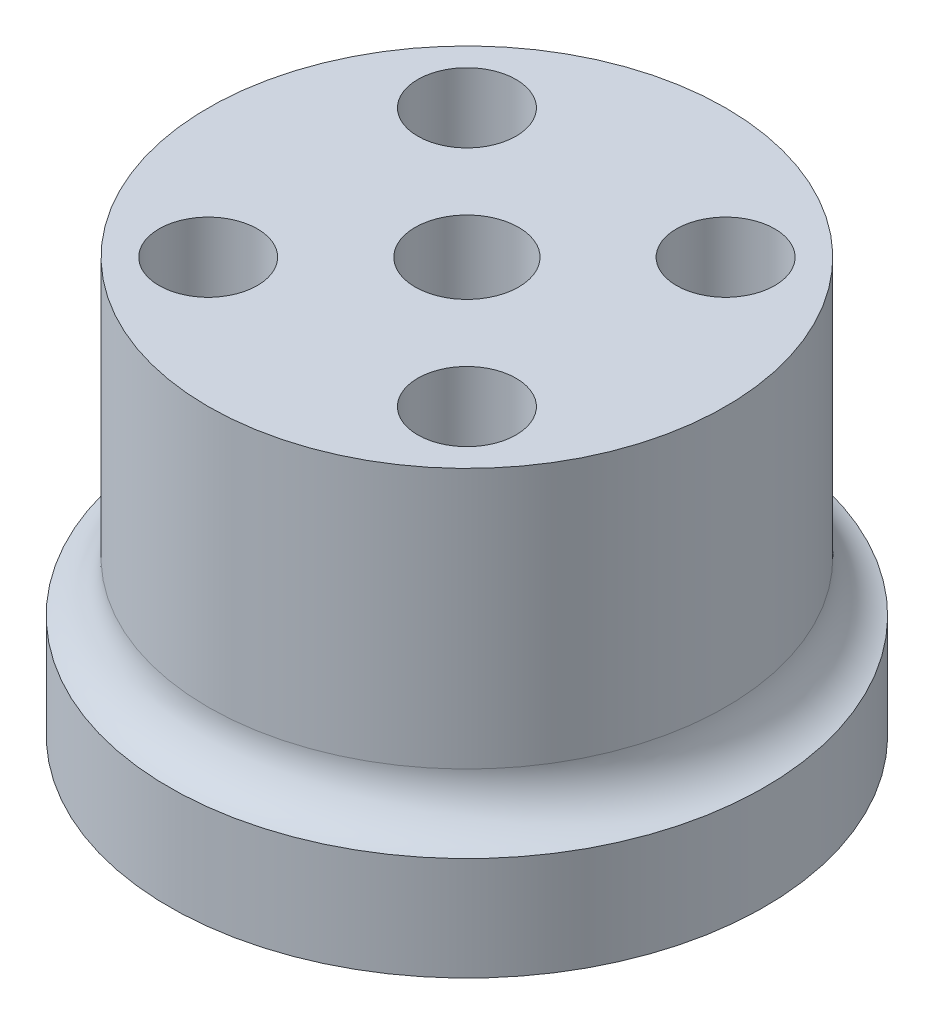
ISO-10303-21;
HEADER;
FILE_DESCRIPTION(('STEP AP214'),'2;1');
FILE_NAME('part.step','',(''),(''),'','','');
FILE_SCHEMA(('AUTOMOTIVE_DESIGN { 1 0 10303 214 1 1 1 1 }'));
ENDSEC;
DATA;
#1=APPLICATION_CONTEXT('core data for automotive mechanical design processes');
#2=APPLICATION_PROTOCOL_DEFINITION('international standard','automotive_design',2000,#1);
#3=PRODUCT_CONTEXT('',#1,'mechanical');
#4=PRODUCT('Part','Part','',(#3));
#5=PRODUCT_RELATED_PRODUCT_CATEGORY('part','',(#4));
#6=PRODUCT_DEFINITION_FORMATION('','',#4);
#7=PRODUCT_DEFINITION_CONTEXT('part definition',#1,'design');
#8=PRODUCT_DEFINITION('design','',#6,#7);
#9=PRODUCT_DEFINITION_SHAPE('','',#8);
#10=(LENGTH_UNIT() NAMED_UNIT(*) SI_UNIT(.MILLI.,.METRE.));
#11=(NAMED_UNIT(*) PLANE_ANGLE_UNIT() SI_UNIT($,.RADIAN.));
#12=(NAMED_UNIT(*) SI_UNIT($,.STERADIAN.) SOLID_ANGLE_UNIT());
#13=UNCERTAINTY_MEASURE_WITH_UNIT(LENGTH_MEASURE(1.E-05),#10,'distance_accuracy_value','');
#14=(GEOMETRIC_REPRESENTATION_CONTEXT(3) GLOBAL_UNCERTAINTY_ASSIGNED_CONTEXT((#13)) GLOBAL_UNIT_ASSIGNED_CONTEXT((#10,
#11,#12)) REPRESENTATION_CONTEXT('',''));
#15=CARTESIAN_POINT('',(0.,0.,0.));
#16=DIRECTION('',(0.,0.,1.));
#17=DIRECTION('',(1.,0.,0.));
#18=AXIS2_PLACEMENT_3D('',#15,#16,#17);
#19=CARTESIAN_POINT('',(0.,20.,0.));
#20=DIRECTION('',(0.,-1.,0.));
#21=DIRECTION('',(0.,0.,-1.));
#22=AXIS2_PLACEMENT_3D('',#19,#20,#21);
#23=CYLINDRICAL_SURFACE('',#22,2.);
#24=CARTESIAN_POINT('',(0.,16.,0.));
#25=DIRECTION('',(0.,1.,0.));
#26=DIRECTION('',(0.,0.,1.));
#27=AXIS2_PLACEMENT_3D('',#24,#25,#26);
#28=CIRCLE('',#27,2.);
#29=CARTESIAN_POINT('',(0.,16.,2.));
#30=VERTEX_POINT('',#29);
#31=EDGE_CURVE('E93',#30,#30,#28,.T.);
#32=ORIENTED_EDGE('',*,*,#31,.T.);
#33=EDGE_LOOP('',(#32));
#34=FACE_BOUND('',#33,.T.);
#35=CARTESIAN_POINT('',(0.,3.,0.));
#36=DIRECTION('',(0.,-1.,0.));
#37=DIRECTION('',(0.,0.,-1.));
#38=AXIS2_PLACEMENT_3D('',#35,#36,#37);
#39=CIRCLE('',#38,2.);
#40=CARTESIAN_POINT('',(0.,3.,-2.));
#41=VERTEX_POINT('',#40);
#42=EDGE_CURVE('E48',#41,#41,#39,.T.);
#43=ORIENTED_EDGE('',*,*,#42,.T.);
#44=EDGE_LOOP('',(#43));
#45=FACE_BOUND('',#44,.T.);
#46=ADVANCED_FACE('F44',(#34,#45),#23,.F.);
#47=CARTESIAN_POINT('',(0.,20.,0.));
#48=DIRECTION('',(0.,-1.,0.));
#49=DIRECTION('',(0.,0.,-1.));
#50=AXIS2_PLACEMENT_3D('',#47,#48,#49);
#51=CYLINDRICAL_SURFACE('',#50,10.);
#52=CARTESIAN_POINT('',(0.,5.93649167310371,0.));
#53=DIRECTION('',(0.,-1.,0.));
#54=DIRECTION('',(0.,0.,-1.));
#55=AXIS2_PLACEMENT_3D('',#52,#53,#54);
#56=CIRCLE('',#55,10.);
#57=CARTESIAN_POINT('',(0.,5.93649167310371,-10.));
#58=VERTEX_POINT('',#57);
#59=EDGE_CURVE('E10',#58,#58,#56,.F.);
#60=ORIENTED_EDGE('',*,*,#59,.T.);
#61=EDGE_LOOP('',(#60));
#62=FACE_BOUND('',#61,.T.);
#63=CARTESIAN_POINT('',(0.,16.,0.));
#64=DIRECTION('',(0.,1.,0.));
#65=DIRECTION('',(0.,0.,1.));
#66=AXIS2_PLACEMENT_3D('',#63,#64,#65);
#67=CIRCLE('',#66,10.);
#68=CARTESIAN_POINT('',(0.,16.,10.));
#69=VERTEX_POINT('',#68);
#70=EDGE_CURVE('E67',#69,#69,#67,.T.);
#71=ORIENTED_EDGE('',*,*,#70,.F.);
#72=EDGE_LOOP('',(#71));
#73=FACE_BOUND('',#72,.T.);
#74=ADVANCED_FACE('F139',(#62,#73),#51,.T.);
#75=CARTESIAN_POINT('',(0.,0.,0.));
#76=DIRECTION('',(0.,1.,0.));
#77=DIRECTION('',(0.,0.,1.));
#78=AXIS2_PLACEMENT_3D('',#75,#76,#77);
#79=PLANE('',#78);
#80=CARTESIAN_POINT('',(0.,0.,0.));
#81=DIRECTION('',(0.,-1.,0.));
#82=DIRECTION('',(0.,0.,-1.));
#83=AXIS2_PLACEMENT_3D('',#80,#81,#82);
#84=CIRCLE('',#83,3.25);
#85=CARTESIAN_POINT('',(0.,0.,-3.25));
#86=VERTEX_POINT('',#85);
#87=EDGE_CURVE('E83',#86,#86,#84,.T.);
#88=ORIENTED_EDGE('',*,*,#87,.F.);
#89=EDGE_LOOP('',(#88));
#90=FACE_BOUND('',#89,.T.);
#91=CARTESIAN_POINT('',(0.,0.,0.));
#92=DIRECTION('',(0.,-1.,0.));
#93=DIRECTION('',(0.,0.,-1.));
#94=AXIS2_PLACEMENT_3D('',#91,#92,#93);
#95=CIRCLE('',#94,11.5);
#96=CARTESIAN_POINT('',(0.,0.,-11.5));
#97=VERTEX_POINT('',#96);
#98=EDGE_CURVE('E97',#97,#97,#95,.T.);
#99=ORIENTED_EDGE('',*,*,#98,.T.);
#100=EDGE_LOOP('',(#99));
#101=FACE_BOUND('',#100,.T.);
#102=ADVANCED_FACE('F147',(#90,#101),#79,.F.);
#103=CARTESIAN_POINT('',(0.,4.,0.));
#104=DIRECTION('',(0.,-1.,0.));
#105=DIRECTION('',(0.,0.,-1.));
#106=AXIS2_PLACEMENT_3D('',#103,#104,#105);
#107=CYLINDRICAL_SURFACE('',#106,11.5);
#108=CARTESIAN_POINT('',(0.,4.,0.));
#109=DIRECTION('',(0.,-1.,0.));
#110=DIRECTION('',(0.,0.,-1.));
#111=AXIS2_PLACEMENT_3D('',#108,#109,#110);
#112=CIRCLE('',#111,11.5);
#113=CARTESIAN_POINT('',(0.,4.,-11.5));
#114=VERTEX_POINT('',#113);
#115=EDGE_CURVE('E98',#114,#114,#112,.T.);
#116=ORIENTED_EDGE('',*,*,#115,.T.);
#117=EDGE_LOOP('',(#116));
#118=FACE_BOUND('',#117,.T.);
#119=ORIENTED_EDGE('',*,*,#98,.F.);
#120=EDGE_LOOP('',(#119));
#121=FACE_BOUND('',#120,.T.);
#122=ADVANCED_FACE('F193',(#118,#121),#107,.T.);
#123=CARTESIAN_POINT('',(0.,5.93649167310371,0.));
#124=DIRECTION('',(0.,-1.,0.));
#125=DIRECTION('',(0.,0.,-1.));
#126=AXIS2_PLACEMENT_3D('',#123,#124,#125);
#127=TOROIDAL_SURFACE('',#126,12.,2.);
#128=ORIENTED_EDGE('',*,*,#59,.F.);
#129=EDGE_LOOP('',(#128));
#130=FACE_BOUND('',#129,.T.);
#131=ORIENTED_EDGE('',*,*,#115,.F.);
#132=EDGE_LOOP('',(#131));
#133=FACE_BOUND('',#132,.T.);
#134=ADVANCED_FACE('F46',(#130,#133),#127,.F.);
#135=CARTESIAN_POINT('',(0.,16.,0.));
#136=DIRECTION('',(0.,1.,0.));
#137=DIRECTION('',(0.,0.,1.));
#138=AXIS2_PLACEMENT_3D('',#135,#136,#137);
#139=PLANE('',#138);
#140=ORIENTED_EDGE('',*,*,#31,.F.);
#141=EDGE_LOOP('',(#140));
#142=FACE_BOUND('',#141,.T.);
#143=CARTESIAN_POINT('',(4.99999999999996,16.,5.00000000000003));
#144=DIRECTION('',(0.,1.,0.));
#145=DIRECTION('',(0.,0.,1.));
#146=AXIS2_PLACEMENT_3D('',#143,#144,#145);
#147=CIRCLE('',#146,1.9);
#148=CARTESIAN_POINT('',(4.99999999999996,16.,6.90000000000003));
#149=VERTEX_POINT('',#148);
#150=EDGE_CURVE('E89',#149,#149,#147,.T.);
#151=ORIENTED_EDGE('',*,*,#150,.F.);
#152=EDGE_LOOP('',(#151));
#153=FACE_BOUND('',#152,.T.);
#154=CARTESIAN_POINT('',(-5.00000000000005,16.,4.99999999999995));
#155=DIRECTION('',(0.,1.,0.));
#156=DIRECTION('',(0.,0.,1.));
#157=AXIS2_PLACEMENT_3D('',#154,#155,#156);
#158=CIRCLE('',#157,1.9);
#159=CARTESIAN_POINT('',(-5.00000000000005,16.,6.89999999999995));
#160=VERTEX_POINT('',#159);
#161=EDGE_CURVE('E73',#160,#160,#158,.T.);
#162=ORIENTED_EDGE('',*,*,#161,.F.);
#163=EDGE_LOOP('',(#162));
#164=FACE_BOUND('',#163,.T.);
#165=CARTESIAN_POINT('',(5.00000000000002,16.,-4.99999999999998));
#166=DIRECTION('',(0.,1.,0.));
#167=DIRECTION('',(0.,0.,1.));
#168=AXIS2_PLACEMENT_3D('',#165,#166,#167);
#169=CIRCLE('',#168,1.9);
#170=CARTESIAN_POINT('',(5.00000000000002,16.,-3.09999999999998));
#171=VERTEX_POINT('',#170);
#172=EDGE_CURVE('E66',#171,#171,#169,.T.);
#173=ORIENTED_EDGE('',*,*,#172,.F.);
#174=EDGE_LOOP('',(#173));
#175=FACE_BOUND('',#174,.T.);
#176=CARTESIAN_POINT('',(-5.,16.,-5.));
#177=DIRECTION('',(0.,1.,0.));
#178=DIRECTION('',(0.,0.,1.));
#179=AXIS2_PLACEMENT_3D('',#176,#177,#178);
#180=CIRCLE('',#179,1.9);
#181=CARTESIAN_POINT('',(-5.,16.,-3.1));
#182=VERTEX_POINT('',#181);
#183=EDGE_CURVE('E63',#182,#182,#180,.T.);
#184=ORIENTED_EDGE('',*,*,#183,.F.);
#185=EDGE_LOOP('',(#184));
#186=FACE_BOUND('',#185,.T.);
#187=ORIENTED_EDGE('',*,*,#70,.T.);
#188=EDGE_LOOP('',(#187));
#189=FACE_BOUND('',#188,.T.);
#190=ADVANCED_FACE('F133',(#142,#153,#164,#175,#186,#189),#139,.T.);
#191=CARTESIAN_POINT('',(0.,4.,0.));
#192=DIRECTION('',(0.,-1.,0.));
#193=DIRECTION('',(0.,0.,-1.));
#194=AXIS2_PLACEMENT_3D('',#191,#192,#193);
#195=PLANE('',#194);
#196=CARTESIAN_POINT('',(5.00000000000002,4.,-4.99999999999998));
#197=DIRECTION('',(0.,-1.,0.));
#198=DIRECTION('',(0.,0.,-1.));
#199=AXIS2_PLACEMENT_3D('',#196,#197,#198);
#200=CIRCLE('',#199,1.9);
#201=CARTESIAN_POINT('',(5.00000000000002,4.,-6.89999999999998));
#202=VERTEX_POINT('',#201);
#203=EDGE_CURVE('E105',#202,#202,#200,.T.);
#204=ORIENTED_EDGE('',*,*,#203,.F.);
#205=EDGE_LOOP('',(#204));
#206=FACE_BOUND('',#205,.T.);
#207=ADVANCED_FACE('F120',(#206),#195,.F.);
#208=CARTESIAN_POINT('',(5.00000000000002,20.,-4.99999999999998));
#209=DIRECTION('',(0.,-1.,0.));
#210=DIRECTION('',(0.,0.,-1.));
#211=AXIS2_PLACEMENT_3D('',#208,#209,#210);
#212=CYLINDRICAL_SURFACE('',#211,1.9);
#213=ORIENTED_EDGE('',*,*,#203,.T.);
#214=EDGE_LOOP('',(#213));
#215=FACE_BOUND('',#214,.T.);
#216=ORIENTED_EDGE('',*,*,#172,.T.);
#217=EDGE_LOOP('',(#216));
#218=FACE_BOUND('',#217,.T.);
#219=ADVANCED_FACE('F118',(#215,#218),#212,.F.);
#220=CARTESIAN_POINT('',(-5.00000000000005,4.,4.99999999999995));
#221=DIRECTION('',(0.,-1.,0.));
#222=DIRECTION('',(0.,0.,-1.));
#223=AXIS2_PLACEMENT_3D('',#220,#221,#222);
#224=CIRCLE('',#223,1.9);
#225=CARTESIAN_POINT('',(-5.00000000000005,4.,3.09999999999995));
#226=VERTEX_POINT('',#225);
#227=EDGE_CURVE('E59',#226,#226,#224,.T.);
#228=ORIENTED_EDGE('',*,*,#227,.F.);
#229=EDGE_LOOP('',(#228));
#230=FACE_BOUND('',#229,.T.);
#231=ADVANCED_FACE('F116',(#230),#195,.F.);
#232=CARTESIAN_POINT('',(-5.00000000000005,20.,4.99999999999995));
#233=DIRECTION('',(0.,-1.,0.));
#234=DIRECTION('',(0.,0.,-1.));
#235=AXIS2_PLACEMENT_3D('',#232,#233,#234);
#236=CYLINDRICAL_SURFACE('',#235,1.9);
#237=ORIENTED_EDGE('',*,*,#227,.T.);
#238=EDGE_LOOP('',(#237));
#239=FACE_BOUND('',#238,.T.);
#240=ORIENTED_EDGE('',*,*,#161,.T.);
#241=EDGE_LOOP('',(#240));
#242=FACE_BOUND('',#241,.T.);
#243=ADVANCED_FACE('F113',(#239,#242),#236,.F.);
#244=CARTESIAN_POINT('',(4.99999999999996,4.,5.00000000000003));
#245=DIRECTION('',(0.,-1.,0.));
#246=DIRECTION('',(0.,0.,-1.));
#247=AXIS2_PLACEMENT_3D('',#244,#245,#246);
#248=CIRCLE('',#247,1.9);
#249=CARTESIAN_POINT('',(4.99999999999996,4.,3.10000000000004));
#250=VERTEX_POINT('',#249);
#251=EDGE_CURVE('E53',#250,#250,#248,.T.);
#252=ORIENTED_EDGE('',*,*,#251,.F.);
#253=EDGE_LOOP('',(#252));
#254=FACE_BOUND('',#253,.T.);
#255=ADVANCED_FACE('F121',(#254),#195,.F.);
#256=CARTESIAN_POINT('',(4.99999999999996,20.,5.00000000000003));
#257=DIRECTION('',(0.,-1.,0.));
#258=DIRECTION('',(0.,0.,-1.));
#259=AXIS2_PLACEMENT_3D('',#256,#257,#258);
#260=CYLINDRICAL_SURFACE('',#259,1.9);
#261=ORIENTED_EDGE('',*,*,#251,.T.);
#262=EDGE_LOOP('',(#261));
#263=FACE_BOUND('',#262,.T.);
#264=ORIENTED_EDGE('',*,*,#150,.T.);
#265=EDGE_LOOP('',(#264));
#266=FACE_BOUND('',#265,.T.);
#267=ADVANCED_FACE('F136',(#263,#266),#260,.F.);
#268=CARTESIAN_POINT('',(-5.,4.,-5.));
#269=DIRECTION('',(0.,-1.,0.));
#270=DIRECTION('',(0.,0.,-1.));
#271=AXIS2_PLACEMENT_3D('',#268,#269,#270);
#272=CIRCLE('',#271,1.9);
#273=CARTESIAN_POINT('',(-5.,4.,-6.9));
#274=VERTEX_POINT('',#273);
#275=EDGE_CURVE('E62',#274,#274,#272,.T.);
#276=ORIENTED_EDGE('',*,*,#275,.F.);
#277=EDGE_LOOP('',(#276));
#278=FACE_BOUND('',#277,.T.);
#279=ADVANCED_FACE('F135',(#278),#195,.F.);
#280=CARTESIAN_POINT('',(-5.,20.,-5.));
#281=DIRECTION('',(0.,-1.,0.));
#282=DIRECTION('',(0.,0.,-1.));
#283=AXIS2_PLACEMENT_3D('',#280,#281,#282);
#284=CYLINDRICAL_SURFACE('',#283,1.9);
#285=ORIENTED_EDGE('',*,*,#275,.T.);
#286=EDGE_LOOP('',(#285));
#287=FACE_BOUND('',#286,.T.);
#288=ORIENTED_EDGE('',*,*,#183,.T.);
#289=EDGE_LOOP('',(#288));
#290=FACE_BOUND('',#289,.T.);
#291=ADVANCED_FACE('F154',(#287,#290),#284,.F.);
#292=CARTESIAN_POINT('',(0.,3.,0.));
#293=DIRECTION('',(0.,-1.,0.));
#294=DIRECTION('',(0.,0.,-1.));
#295=AXIS2_PLACEMENT_3D('',#292,#293,#294);
#296=CYLINDRICAL_SURFACE('',#295,3.25);
#297=CARTESIAN_POINT('',(0.,3.,0.));
#298=DIRECTION('',(0.,-1.,0.));
#299=DIRECTION('',(0.,0.,-1.));
#300=AXIS2_PLACEMENT_3D('',#297,#298,#299);
#301=CIRCLE('',#300,3.25);
#302=CARTESIAN_POINT('',(0.,3.,-3.25));
#303=VERTEX_POINT('',#302);
#304=EDGE_CURVE('E81',#303,#303,#301,.T.);
#305=ORIENTED_EDGE('',*,*,#304,.F.);
#306=EDGE_LOOP('',(#305));
#307=FACE_BOUND('',#306,.T.);
#308=ORIENTED_EDGE('',*,*,#87,.T.);
#309=EDGE_LOOP('',(#308));
#310=FACE_BOUND('',#309,.T.);
#311=ADVANCED_FACE('F155',(#307,#310),#296,.F.);
#312=CARTESIAN_POINT('',(0.,3.,0.));
#313=DIRECTION('',(0.,-1.,0.));
#314=DIRECTION('',(0.,0.,-1.));
#315=AXIS2_PLACEMENT_3D('',#312,#313,#314);
#316=PLANE('',#315);
#317=ORIENTED_EDGE('',*,*,#42,.F.);
#318=EDGE_LOOP('',(#317));
#319=FACE_BOUND('',#318,.T.);
#320=ORIENTED_EDGE('',*,*,#304,.T.);
#321=EDGE_LOOP('',(#320));
#322=FACE_BOUND('',#321,.T.);
#323=ADVANCED_FACE('F160',(#319,#322),#316,.T.);
#324=CLOSED_SHELL('',(#46,#74,#102,#122,#134,#190,#207,#219,#231,#243,#255,#267,#279,#291,#311,#323));
#325=MANIFOLD_SOLID_BREP('B2',#324);
#326=ADVANCED_BREP_SHAPE_REPRESENTATION('',(#18,#325),#14);
#327=SHAPE_DEFINITION_REPRESENTATION(#9,#326);
ENDSEC;
END-ISO-10303-21;
